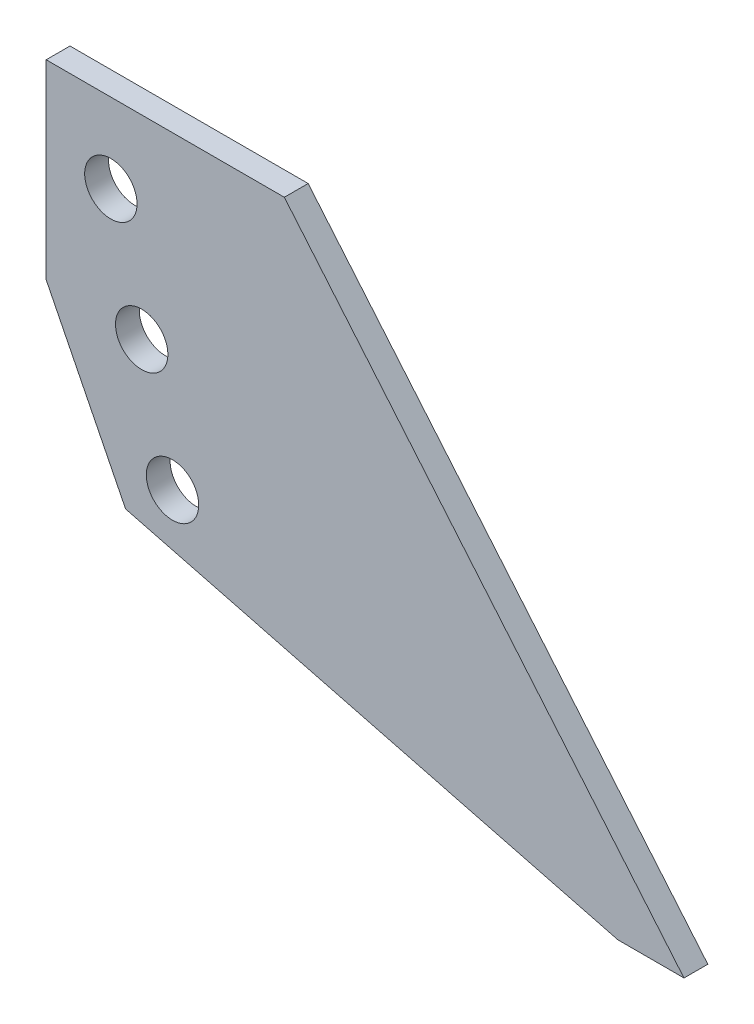
ISO-10303-21;
HEADER;
FILE_DESCRIPTION(('STEP AP214'),'2;1');
FILE_NAME('part.step','',(''),(''),'','','');
FILE_SCHEMA(('AUTOMOTIVE_DESIGN { 1 0 10303 214 1 1 1 1 }'));
ENDSEC;
DATA;
#1=APPLICATION_CONTEXT('core data for automotive mechanical design processes');
#2=APPLICATION_PROTOCOL_DEFINITION('international standard','automotive_design',2000,#1);
#3=PRODUCT_CONTEXT('',#1,'mechanical');
#4=PRODUCT('Part','Part','',(#3));
#5=PRODUCT_RELATED_PRODUCT_CATEGORY('part','',(#4));
#6=PRODUCT_DEFINITION_FORMATION('','',#4);
#7=PRODUCT_DEFINITION_CONTEXT('part definition',#1,'design');
#8=PRODUCT_DEFINITION('design','',#6,#7);
#9=PRODUCT_DEFINITION_SHAPE('','',#8);
#10=(LENGTH_UNIT() NAMED_UNIT(*) SI_UNIT(.MILLI.,.METRE.));
#11=(NAMED_UNIT(*) PLANE_ANGLE_UNIT() SI_UNIT($,.RADIAN.));
#12=(NAMED_UNIT(*) SI_UNIT($,.STERADIAN.) SOLID_ANGLE_UNIT());
#13=UNCERTAINTY_MEASURE_WITH_UNIT(LENGTH_MEASURE(1.E-05),#10,'distance_accuracy_value','');
#14=(GEOMETRIC_REPRESENTATION_CONTEXT(3) GLOBAL_UNCERTAINTY_ASSIGNED_CONTEXT((#13)) GLOBAL_UNIT_ASSIGNED_CONTEXT((#10,
#11,#12)) REPRESENTATION_CONTEXT('',''));
#15=CARTESIAN_POINT('',(0.,0.,0.));
#16=DIRECTION('',(0.,0.,1.));
#17=DIRECTION('',(1.,0.,0.));
#18=AXIS2_PLACEMENT_3D('',#15,#16,#17);
#19=CARTESIAN_POINT('',(80.3459778706374,0.,3.));
#20=DIRECTION('',(0.,1.,0.));
#21=DIRECTION('',(-1.,0.,0.));
#22=AXIS2_PLACEMENT_3D('',#19,#20,#21);
#23=PLANE('',#22);
#24=DIRECTION('',(1.,0.,0.));
#25=VECTOR('',#24,1.);
#26=CARTESIAN_POINT('',(80.3459778706374,0.,3.));
#27=LINE('',#26,#25);
#28=CARTESIAN_POINT('',(72.,0.,3.));
#29=VERTEX_POINT('',#28);
#30=CARTESIAN_POINT('',(80.3459778706374,0.,3.));
#31=VERTEX_POINT('',#30);
#32=EDGE_CURVE('E85',#29,#31,#27,.T.);
#33=ORIENTED_EDGE('',*,*,#32,.F.);
#34=DIRECTION('',(0.,0.,1.));
#35=VECTOR('',#34,1.);
#36=CARTESIAN_POINT('',(72.,0.,0.));
#37=LINE('',#36,#35);
#38=CARTESIAN_POINT('',(72.,0.,0.));
#39=VERTEX_POINT('',#38);
#40=EDGE_CURVE('E105',#39,#29,#37,.T.);
#41=ORIENTED_EDGE('',*,*,#40,.F.);
#42=DIRECTION('',(1.,0.,0.));
#43=VECTOR('',#42,1.);
#44=CARTESIAN_POINT('',(80.3459778706374,0.,0.));
#45=LINE('',#44,#43);
#46=CARTESIAN_POINT('',(80.3459778706374,0.,0.));
#47=VERTEX_POINT('',#46);
#48=EDGE_CURVE('E114',#39,#47,#45,.T.);
#49=ORIENTED_EDGE('',*,*,#48,.T.);
#50=DIRECTION('',(0.,0.,-1.));
#51=VECTOR('',#50,1.);
#52=CARTESIAN_POINT('',(80.3459778706374,0.,3.));
#53=LINE('',#52,#51);
#54=EDGE_CURVE('E11',#31,#47,#53,.T.);
#55=ORIENTED_EDGE('',*,*,#54,.F.);
#56=EDGE_LOOP('',(#33,#41,#49,#55));
#57=FACE_BOUND('',#56,.T.);
#58=ADVANCED_FACE('F39',(#57),#23,.F.);
#59=CARTESIAN_POINT('',(30.,60.,3.));
#60=DIRECTION('',(-0.766044443118974,-0.642787609686544,0.));
#61=DIRECTION('',(0.642787609686544,-0.766044443118974,0.));
#62=AXIS2_PLACEMENT_3D('',#59,#60,#61);
#63=PLANE('',#62);
#64=DIRECTION('',(-0.642787609686544,0.766044443118974,0.));
#65=VECTOR('',#64,1.);
#66=CARTESIAN_POINT('',(30.,60.,0.));
#67=LINE('',#66,#65);
#68=CARTESIAN_POINT('',(30.,60.,0.));
#69=VERTEX_POINT('',#68);
#70=EDGE_CURVE('E120',#47,#69,#67,.T.);
#71=ORIENTED_EDGE('',*,*,#70,.T.);
#72=DIRECTION('',(0.,0.,-1.));
#73=VECTOR('',#72,1.);
#74=CARTESIAN_POINT('',(30.,60.,3.));
#75=LINE('',#74,#73);
#76=CARTESIAN_POINT('',(30.,60.,3.));
#77=VERTEX_POINT('',#76);
#78=EDGE_CURVE('E47',#77,#69,#75,.T.);
#79=ORIENTED_EDGE('',*,*,#78,.F.);
#80=DIRECTION('',(-0.642787609686544,0.766044443118974,0.));
#81=VECTOR('',#80,1.);
#82=CARTESIAN_POINT('',(30.,60.,3.));
#83=LINE('',#82,#81);
#84=EDGE_CURVE('E155',#31,#77,#83,.T.);
#85=ORIENTED_EDGE('',*,*,#84,.F.);
#86=ORIENTED_EDGE('',*,*,#54,.T.);
#87=EDGE_LOOP('',(#71,#79,#85,#86));
#88=FACE_BOUND('',#87,.T.);
#89=ADVANCED_FACE('F204',(#88),#63,.F.);
#90=CARTESIAN_POINT('',(0.,60.,3.));
#91=DIRECTION('',(0.,-1.,0.));
#92=DIRECTION('',(0.,0.,-1.));
#93=AXIS2_PLACEMENT_3D('',#90,#91,#92);
#94=PLANE('',#93);
#95=DIRECTION('',(-1.,0.,0.));
#96=VECTOR('',#95,1.);
#97=CARTESIAN_POINT('',(0.,60.,0.));
#98=LINE('',#97,#96);
#99=CARTESIAN_POINT('',(0.,60.,0.));
#100=VERTEX_POINT('',#99);
#101=EDGE_CURVE('E80',#69,#100,#98,.T.);
#102=ORIENTED_EDGE('',*,*,#101,.T.);
#103=DIRECTION('',(0.,0.,-1.));
#104=VECTOR('',#103,1.);
#105=CARTESIAN_POINT('',(0.,60.,3.));
#106=LINE('',#105,#104);
#107=CARTESIAN_POINT('',(0.,60.,3.));
#108=VERTEX_POINT('',#107);
#109=EDGE_CURVE('E140',#108,#100,#106,.T.);
#110=ORIENTED_EDGE('',*,*,#109,.F.);
#111=DIRECTION('',(-1.,0.,0.));
#112=VECTOR('',#111,1.);
#113=CARTESIAN_POINT('',(0.,60.,3.));
#114=LINE('',#113,#112);
#115=EDGE_CURVE('E63',#77,#108,#114,.T.);
#116=ORIENTED_EDGE('',*,*,#115,.F.);
#117=ORIENTED_EDGE('',*,*,#78,.T.);
#118=EDGE_LOOP('',(#102,#110,#116,#117));
#119=FACE_BOUND('',#118,.T.);
#120=ADVANCED_FACE('F144',(#119),#94,.F.);
#121=CARTESIAN_POINT('',(0.,0.,3.));
#122=DIRECTION('',(1.,0.,0.));
#123=DIRECTION('',(0.,0.,-1.));
#124=AXIS2_PLACEMENT_3D('',#121,#122,#123);
#125=PLANE('',#124);
#126=DIRECTION('',(0.,-1.,0.));
#127=VECTOR('',#126,1.);
#128=CARTESIAN_POINT('',(0.,0.,0.));
#129=LINE('',#128,#127);
#130=CARTESIAN_POINT('',(0.,36.,0.));
#131=VERTEX_POINT('',#130);
#132=EDGE_CURVE('E136',#100,#131,#129,.T.);
#133=ORIENTED_EDGE('',*,*,#132,.T.);
#134=DIRECTION('',(0.,0.,1.));
#135=VECTOR('',#134,1.);
#136=CARTESIAN_POINT('',(0.,36.,0.));
#137=LINE('',#136,#135);
#138=CARTESIAN_POINT('',(0.,36.,3.));
#139=VERTEX_POINT('',#138);
#140=EDGE_CURVE('E151',#131,#139,#137,.T.);
#141=ORIENTED_EDGE('',*,*,#140,.T.);
#142=DIRECTION('',(0.,-1.,0.));
#143=VECTOR('',#142,1.);
#144=CARTESIAN_POINT('',(0.,0.,3.));
#145=LINE('',#144,#143);
#146=EDGE_CURVE('E131',#108,#139,#145,.T.);
#147=ORIENTED_EDGE('',*,*,#146,.F.);
#148=ORIENTED_EDGE('',*,*,#109,.T.);
#149=EDGE_LOOP('',(#133,#141,#147,#148));
#150=FACE_BOUND('',#149,.T.);
#151=ADVANCED_FACE('F149',(#150),#125,.F.);
#152=CARTESIAN_POINT('',(0.,0.,3.));
#153=DIRECTION('',(0.,0.,-1.));
#154=DIRECTION('',(-1.,0.,0.));
#155=AXIS2_PLACEMENT_3D('',#152,#153,#154);
#156=PLANE('',#155);
#157=CARTESIAN_POINT('',(15.9131425281419,21.022225211327,3.));
#158=DIRECTION('',(0.,0.,1.));
#159=DIRECTION('',(1.,0.,0.));
#160=AXIS2_PLACEMENT_3D('',#157,#158,#159);
#161=CIRCLE('',#160,3.3);
#162=CARTESIAN_POINT('',(19.2131425281419,21.022225211327,3.));
#163=VERTEX_POINT('',#162);
#164=EDGE_CURVE('E176',#163,#163,#161,.T.);
#165=ORIENTED_EDGE('',*,*,#164,.F.);
#166=EDGE_LOOP('',(#165));
#167=FACE_BOUND('',#166,.T.);
#168=CARTESIAN_POINT('',(12.0308568516041,35.5111126056631,3.));
#169=DIRECTION('',(0.,0.,1.));
#170=DIRECTION('',(1.,0.,0.));
#171=AXIS2_PLACEMENT_3D('',#168,#169,#170);
#172=CIRCLE('',#171,3.3);
#173=CARTESIAN_POINT('',(15.3308568516041,35.5111126056631,3.));
#174=VERTEX_POINT('',#173);
#175=EDGE_CURVE('E168',#174,#174,#172,.T.);
#176=ORIENTED_EDGE('',*,*,#175,.F.);
#177=EDGE_LOOP('',(#176));
#178=FACE_BOUND('',#177,.T.);
#179=CARTESIAN_POINT('',(8.14857117506629,49.9999999999991,3.));
#180=DIRECTION('',(0.,0.,1.));
#181=DIRECTION('',(1.,0.,0.));
#182=AXIS2_PLACEMENT_3D('',#179,#180,#181);
#183=CIRCLE('',#182,3.3);
#184=CARTESIAN_POINT('',(11.4485711750663,49.9999999999991,3.));
#185=VERTEX_POINT('',#184);
#186=EDGE_CURVE('E128',#185,#185,#183,.T.);
#187=ORIENTED_EDGE('',*,*,#186,.F.);
#188=EDGE_LOOP('',(#187));
#189=FACE_BOUND('',#188,.T.);
#190=ORIENTED_EDGE('',*,*,#146,.T.);
#191=DIRECTION('',(-0.447213595499958,0.894427190999916,0.));
#192=VECTOR('',#191,1.);
#193=CARTESIAN_POINT('',(0.,36.,3.));
#194=LINE('',#193,#192);
#195=CARTESIAN_POINT('',(10.,16.,3.));
#196=VERTEX_POINT('',#195);
#197=EDGE_CURVE('E110',#196,#139,#194,.T.);
#198=ORIENTED_EDGE('',*,*,#197,.F.);
#199=DIRECTION('',(-0.968277323709357,0.24987801902177,0.));
#200=VECTOR('',#199,1.);
#201=CARTESIAN_POINT('',(10.,16.,3.));
#202=LINE('',#201,#200);
#203=EDGE_CURVE('E186',#29,#196,#202,.T.);
#204=ORIENTED_EDGE('',*,*,#203,.F.);
#205=ORIENTED_EDGE('',*,*,#32,.T.);
#206=ORIENTED_EDGE('',*,*,#84,.T.);
#207=ORIENTED_EDGE('',*,*,#115,.T.);
#208=EDGE_LOOP('',(#190,#198,#204,#205,#206,#207));
#209=FACE_BOUND('',#208,.T.);
#210=ADVANCED_FACE('F190',(#167,#178,#189,#209),#156,.F.);
#211=CARTESIAN_POINT('',(0.,0.,0.));
#212=DIRECTION('',(0.,0.,-1.));
#213=DIRECTION('',(-1.,0.,0.));
#214=AXIS2_PLACEMENT_3D('',#211,#212,#213);
#215=PLANE('',#214);
#216=DIRECTION('',(-0.447213595499958,0.894427190999916,0.));
#217=VECTOR('',#216,1.);
#218=CARTESIAN_POINT('',(0.,36.,0.));
#219=LINE('',#218,#217);
#220=CARTESIAN_POINT('',(10.,16.,0.));
#221=VERTEX_POINT('',#220);
#222=EDGE_CURVE('E54',#221,#131,#219,.T.);
#223=ORIENTED_EDGE('',*,*,#222,.T.);
#224=ORIENTED_EDGE('',*,*,#132,.F.);
#225=ORIENTED_EDGE('',*,*,#101,.F.);
#226=ORIENTED_EDGE('',*,*,#70,.F.);
#227=ORIENTED_EDGE('',*,*,#48,.F.);
#228=DIRECTION('',(-0.968277323709357,0.24987801902177,0.));
#229=VECTOR('',#228,1.);
#230=CARTESIAN_POINT('',(10.,16.,0.));
#231=LINE('',#230,#229);
#232=EDGE_CURVE('E101',#39,#221,#231,.T.);
#233=ORIENTED_EDGE('',*,*,#232,.T.);
#234=EDGE_LOOP('',(#223,#224,#225,#226,#227,#233));
#235=FACE_BOUND('',#234,.T.);
#236=CARTESIAN_POINT('',(15.9131425281419,21.022225211327,0.));
#237=DIRECTION('',(0.,0.,1.));
#238=DIRECTION('',(1.,0.,0.));
#239=AXIS2_PLACEMENT_3D('',#236,#237,#238);
#240=CIRCLE('',#239,3.3);
#241=CARTESIAN_POINT('',(19.2131425281419,21.022225211327,0.));
#242=VERTEX_POINT('',#241);
#243=EDGE_CURVE('E172',#242,#242,#240,.T.);
#244=ORIENTED_EDGE('',*,*,#243,.T.);
#245=EDGE_LOOP('',(#244));
#246=FACE_BOUND('',#245,.T.);
#247=CARTESIAN_POINT('',(12.0308568516041,35.5111126056631,0.));
#248=DIRECTION('',(0.,0.,1.));
#249=DIRECTION('',(1.,0.,0.));
#250=AXIS2_PLACEMENT_3D('',#247,#248,#249);
#251=CIRCLE('',#250,3.3);
#252=CARTESIAN_POINT('',(15.3308568516041,35.5111126056631,0.));
#253=VERTEX_POINT('',#252);
#254=EDGE_CURVE('E164',#253,#253,#251,.T.);
#255=ORIENTED_EDGE('',*,*,#254,.T.);
#256=EDGE_LOOP('',(#255));
#257=FACE_BOUND('',#256,.T.);
#258=CARTESIAN_POINT('',(8.14857117506629,49.9999999999991,0.));
#259=DIRECTION('',(0.,0.,1.));
#260=DIRECTION('',(1.,0.,0.));
#261=AXIS2_PLACEMENT_3D('',#258,#259,#260);
#262=CIRCLE('',#261,3.3);
#263=CARTESIAN_POINT('',(11.4485711750663,49.9999999999991,0.));
#264=VERTEX_POINT('',#263);
#265=EDGE_CURVE('E122',#264,#264,#262,.T.);
#266=ORIENTED_EDGE('',*,*,#265,.T.);
#267=EDGE_LOOP('',(#266));
#268=FACE_BOUND('',#267,.T.);
#269=ADVANCED_FACE('F118',(#235,#246,#257,#268),#215,.T.);
#270=CARTESIAN_POINT('',(8.14857117506629,49.9999999999991,3.));
#271=DIRECTION('',(0.,0.,1.));
#272=DIRECTION('',(1.,0.,0.));
#273=AXIS2_PLACEMENT_3D('',#270,#271,#272);
#274=CYLINDRICAL_SURFACE('',#273,3.3);
#275=ORIENTED_EDGE('',*,*,#265,.F.);
#276=EDGE_LOOP('',(#275));
#277=FACE_BOUND('',#276,.T.);
#278=ORIENTED_EDGE('',*,*,#186,.T.);
#279=EDGE_LOOP('',(#278));
#280=FACE_BOUND('',#279,.T.);
#281=ADVANCED_FACE('F217',(#277,#280),#274,.F.);
#282=CARTESIAN_POINT('',(12.0308568516041,35.5111126056631,3.));
#283=DIRECTION('',(0.,0.,1.));
#284=DIRECTION('',(1.,0.,0.));
#285=AXIS2_PLACEMENT_3D('',#282,#283,#284);
#286=CYLINDRICAL_SURFACE('',#285,3.3);
#287=ORIENTED_EDGE('',*,*,#254,.F.);
#288=EDGE_LOOP('',(#287));
#289=FACE_BOUND('',#288,.T.);
#290=ORIENTED_EDGE('',*,*,#175,.T.);
#291=EDGE_LOOP('',(#290));
#292=FACE_BOUND('',#291,.T.);
#293=ADVANCED_FACE('F200',(#289,#292),#286,.F.);
#294=CARTESIAN_POINT('',(15.9131425281419,21.022225211327,3.));
#295=DIRECTION('',(0.,0.,1.));
#296=DIRECTION('',(1.,0.,0.));
#297=AXIS2_PLACEMENT_3D('',#294,#295,#296);
#298=CYLINDRICAL_SURFACE('',#297,3.3);
#299=ORIENTED_EDGE('',*,*,#243,.F.);
#300=EDGE_LOOP('',(#299));
#301=FACE_BOUND('',#300,.T.);
#302=ORIENTED_EDGE('',*,*,#164,.T.);
#303=EDGE_LOOP('',(#302));
#304=FACE_BOUND('',#303,.T.);
#305=ADVANCED_FACE('F193',(#301,#304),#298,.F.);
#306=CARTESIAN_POINT('',(0.,36.,0.));
#307=DIRECTION('',(0.894427190999916,0.447213595499958,0.));
#308=DIRECTION('',(-0.447213595499958,0.894427190999916,0.));
#309=AXIS2_PLACEMENT_3D('',#306,#307,#308);
#310=PLANE('',#309);
#311=ORIENTED_EDGE('',*,*,#197,.T.);
#312=ORIENTED_EDGE('',*,*,#140,.F.);
#313=ORIENTED_EDGE('',*,*,#222,.F.);
#314=DIRECTION('',(0.,0.,1.));
#315=VECTOR('',#314,1.);
#316=CARTESIAN_POINT('',(10.,16.,0.));
#317=LINE('',#316,#315);
#318=EDGE_CURVE('E106',#221,#196,#317,.T.);
#319=ORIENTED_EDGE('',*,*,#318,.T.);
#320=EDGE_LOOP('',(#311,#312,#313,#319));
#321=FACE_BOUND('',#320,.T.);
#322=ADVANCED_FACE('F191',(#321),#310,.F.);
#323=CARTESIAN_POINT('',(10.,16.,0.));
#324=DIRECTION('',(0.24987801902177,0.968277323709358,0.));
#325=DIRECTION('',(-0.968277323709358,0.24987801902177,0.));
#326=AXIS2_PLACEMENT_3D('',#323,#324,#325);
#327=PLANE('',#326);
#328=ORIENTED_EDGE('',*,*,#203,.T.);
#329=ORIENTED_EDGE('',*,*,#318,.F.);
#330=ORIENTED_EDGE('',*,*,#232,.F.);
#331=ORIENTED_EDGE('',*,*,#40,.T.);
#332=EDGE_LOOP('',(#328,#329,#330,#331));
#333=FACE_BOUND('',#332,.T.);
#334=ADVANCED_FACE('F104',(#333),#327,.F.);
#335=CLOSED_SHELL('',(#58,#89,#120,#151,#210,#269,#281,#293,#305,#322,#334));
#336=MANIFOLD_SOLID_BREP('B2',#335);
#337=ADVANCED_BREP_SHAPE_REPRESENTATION('',(#18,#336),#14);
#338=SHAPE_DEFINITION_REPRESENTATION(#9,#337);
ENDSEC;
END-ISO-10303-21;
